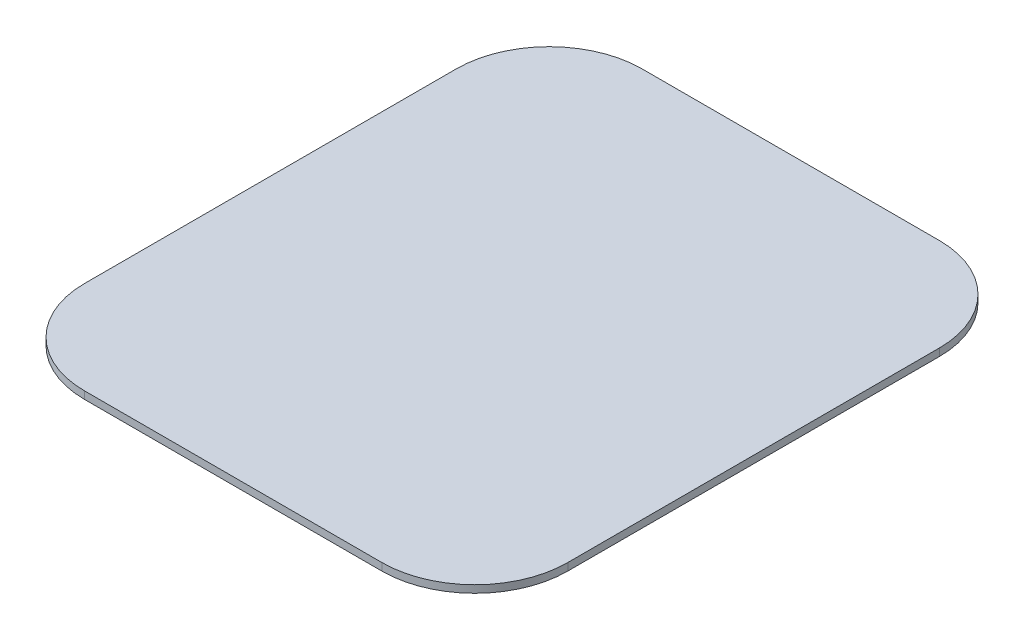
ISO-10303-21;
HEADER;
FILE_DESCRIPTION(('STEP AP214'),'2;1');
FILE_NAME('part.step','',(''),(''),'','','');
FILE_SCHEMA(('AUTOMOTIVE_DESIGN { 1 0 10303 214 1 1 1 1 }'));
ENDSEC;
DATA;
#1=APPLICATION_CONTEXT('core data for automotive mechanical design processes');
#2=APPLICATION_PROTOCOL_DEFINITION('international standard','automotive_design',2000,#1);
#3=PRODUCT_CONTEXT('',#1,'mechanical');
#4=PRODUCT('Part','Part','',(#3));
#5=PRODUCT_RELATED_PRODUCT_CATEGORY('part','',(#4));
#6=PRODUCT_DEFINITION_FORMATION('','',#4);
#7=PRODUCT_DEFINITION_CONTEXT('part definition',#1,'design');
#8=PRODUCT_DEFINITION('design','',#6,#7);
#9=PRODUCT_DEFINITION_SHAPE('','',#8);
#10=(LENGTH_UNIT() NAMED_UNIT(*) SI_UNIT(.MILLI.,.METRE.));
#11=(NAMED_UNIT(*) PLANE_ANGLE_UNIT() SI_UNIT($,.RADIAN.));
#12=(NAMED_UNIT(*) SI_UNIT($,.STERADIAN.) SOLID_ANGLE_UNIT());
#13=UNCERTAINTY_MEASURE_WITH_UNIT(LENGTH_MEASURE(1.E-05),#10,'distance_accuracy_value','');
#14=(GEOMETRIC_REPRESENTATION_CONTEXT(3) GLOBAL_UNCERTAINTY_ASSIGNED_CONTEXT((#13)) GLOBAL_UNIT_ASSIGNED_CONTEXT((#10,
#11,#12)) REPRESENTATION_CONTEXT('',''));
#15=CARTESIAN_POINT('',(0.,0.,0.));
#16=DIRECTION('',(0.,0.,1.));
#17=DIRECTION('',(1.,0.,0.));
#18=AXIS2_PLACEMENT_3D('',#15,#16,#17);
#19=CARTESIAN_POINT('',(160.,4.,-200.));
#20=DIRECTION('',(0.,-1.,0.));
#21=DIRECTION('',(0.,0.,-1.));
#22=AXIS2_PLACEMENT_3D('',#19,#20,#21);
#23=CYLINDRICAL_SURFACE('',#22,100.);
#24=CARTESIAN_POINT('',(160.,-4.,-200.));
#25=DIRECTION('',(0.,1.,0.));
#26=DIRECTION('',(0.,0.,-1.));
#27=AXIS2_PLACEMENT_3D('',#24,#25,#26);
#28=CIRCLE('',#27,100.);
#29=CARTESIAN_POINT('',(260.,-4.,-200.));
#30=VERTEX_POINT('',#29);
#31=CARTESIAN_POINT('',(160.,-4.,-300.));
#32=VERTEX_POINT('',#31);
#33=EDGE_CURVE('E129',#30,#32,#28,.T.);
#34=ORIENTED_EDGE('',*,*,#33,.T.);
#35=DIRECTION('',(0.,-1.,0.));
#36=VECTOR('',#35,1.);
#37=CARTESIAN_POINT('',(160.,4.,-300.));
#38=LINE('',#37,#36);
#39=CARTESIAN_POINT('',(160.,4.,-300.));
#40=VERTEX_POINT('',#39);
#41=EDGE_CURVE('E11',#40,#32,#38,.T.);
#42=ORIENTED_EDGE('',*,*,#41,.F.);
#43=CARTESIAN_POINT('',(160.,4.,-200.));
#44=DIRECTION('',(0.,1.,0.));
#45=DIRECTION('',(0.,0.,-1.));
#46=AXIS2_PLACEMENT_3D('',#43,#44,#45);
#47=CIRCLE('',#46,100.);
#48=CARTESIAN_POINT('',(260.,4.,-200.));
#49=VERTEX_POINT('',#48);
#50=EDGE_CURVE('E143',#49,#40,#47,.T.);
#51=ORIENTED_EDGE('',*,*,#50,.F.);
#52=DIRECTION('',(0.,-1.,0.));
#53=VECTOR('',#52,1.);
#54=CARTESIAN_POINT('',(260.,4.,-200.));
#55=LINE('',#54,#53);
#56=EDGE_CURVE('E125',#49,#30,#55,.T.);
#57=ORIENTED_EDGE('',*,*,#56,.T.);
#58=EDGE_LOOP('',(#34,#42,#51,#57));
#59=FACE_BOUND('',#58,.T.);
#60=ADVANCED_FACE('F33',(#59),#23,.T.);
#61=CARTESIAN_POINT('',(-160.,4.,-300.));
#62=DIRECTION('',(0.,0.,1.));
#63=DIRECTION('',(1.,0.,0.));
#64=AXIS2_PLACEMENT_3D('',#61,#62,#63);
#65=PLANE('',#64);
#66=DIRECTION('',(-1.,0.,0.));
#67=VECTOR('',#66,1.);
#68=CARTESIAN_POINT('',(-160.,-4.,-300.));
#69=LINE('',#68,#67);
#70=CARTESIAN_POINT('',(-160.,-4.,-300.));
#71=VERTEX_POINT('',#70);
#72=EDGE_CURVE('E132',#32,#71,#69,.T.);
#73=ORIENTED_EDGE('',*,*,#72,.T.);
#74=DIRECTION('',(0.,-1.,0.));
#75=VECTOR('',#74,1.);
#76=CARTESIAN_POINT('',(-160.,4.,-300.));
#77=LINE('',#76,#75);
#78=CARTESIAN_POINT('',(-160.,4.,-300.));
#79=VERTEX_POINT('',#78);
#80=EDGE_CURVE('E41',#79,#71,#77,.T.);
#81=ORIENTED_EDGE('',*,*,#80,.F.);
#82=DIRECTION('',(-1.,0.,0.));
#83=VECTOR('',#82,1.);
#84=CARTESIAN_POINT('',(-160.,4.,-300.));
#85=LINE('',#84,#83);
#86=EDGE_CURVE('E92',#40,#79,#85,.T.);
#87=ORIENTED_EDGE('',*,*,#86,.F.);
#88=ORIENTED_EDGE('',*,*,#41,.T.);
#89=EDGE_LOOP('',(#73,#81,#87,#88));
#90=FACE_BOUND('',#89,.T.);
#91=ADVANCED_FACE('F178',(#90),#65,.F.);
#92=CARTESIAN_POINT('',(-160.,4.,-200.));
#93=DIRECTION('',(0.,-1.,0.));
#94=DIRECTION('',(0.,0.,-1.));
#95=AXIS2_PLACEMENT_3D('',#92,#93,#94);
#96=CYLINDRICAL_SURFACE('',#95,100.);
#97=CARTESIAN_POINT('',(-160.,-4.,-200.));
#98=DIRECTION('',(0.,1.,0.));
#99=DIRECTION('',(0.,0.,1.));
#100=AXIS2_PLACEMENT_3D('',#97,#98,#99);
#101=CIRCLE('',#100,100.);
#102=CARTESIAN_POINT('',(-260.,-4.,-200.));
#103=VERTEX_POINT('',#102);
#104=EDGE_CURVE('E134',#71,#103,#101,.T.);
#105=ORIENTED_EDGE('',*,*,#104,.T.);
#106=DIRECTION('',(0.,-1.,0.));
#107=VECTOR('',#106,1.);
#108=CARTESIAN_POINT('',(-260.,4.,-200.));
#109=LINE('',#108,#107);
#110=CARTESIAN_POINT('',(-260.,4.,-200.));
#111=VERTEX_POINT('',#110);
#112=EDGE_CURVE('E150',#111,#103,#109,.T.);
#113=ORIENTED_EDGE('',*,*,#112,.F.);
#114=CARTESIAN_POINT('',(-160.,4.,-200.));
#115=DIRECTION('',(0.,1.,0.));
#116=DIRECTION('',(0.,0.,1.));
#117=AXIS2_PLACEMENT_3D('',#114,#115,#116);
#118=CIRCLE('',#117,100.);
#119=EDGE_CURVE('E158',#79,#111,#118,.T.);
#120=ORIENTED_EDGE('',*,*,#119,.F.);
#121=ORIENTED_EDGE('',*,*,#80,.T.);
#122=EDGE_LOOP('',(#105,#113,#120,#121));
#123=FACE_BOUND('',#122,.T.);
#124=ADVANCED_FACE('F156',(#123),#96,.T.);
#125=CARTESIAN_POINT('',(-260.,4.,-200.));
#126=DIRECTION('',(1.,0.,0.));
#127=DIRECTION('',(0.,0.,-1.));
#128=AXIS2_PLACEMENT_3D('',#125,#126,#127);
#129=PLANE('',#128);
#130=DIRECTION('',(0.,0.,1.));
#131=VECTOR('',#130,1.);
#132=CARTESIAN_POINT('',(-260.,-4.,-200.));
#133=LINE('',#132,#131);
#134=CARTESIAN_POINT('',(-260.,-4.,200.));
#135=VERTEX_POINT('',#134);
#136=EDGE_CURVE('E136',#103,#135,#133,.T.);
#137=ORIENTED_EDGE('',*,*,#136,.T.);
#138=DIRECTION('',(0.,-1.,0.));
#139=VECTOR('',#138,1.);
#140=CARTESIAN_POINT('',(-260.,4.,200.));
#141=LINE('',#140,#139);
#142=CARTESIAN_POINT('',(-260.,4.,200.));
#143=VERTEX_POINT('',#142);
#144=EDGE_CURVE('E147',#143,#135,#141,.T.);
#145=ORIENTED_EDGE('',*,*,#144,.F.);
#146=DIRECTION('',(0.,0.,1.));
#147=VECTOR('',#146,1.);
#148=CARTESIAN_POINT('',(-260.,4.,-200.));
#149=LINE('',#148,#147);
#150=EDGE_CURVE('E170',#111,#143,#149,.T.);
#151=ORIENTED_EDGE('',*,*,#150,.F.);
#152=ORIENTED_EDGE('',*,*,#112,.T.);
#153=EDGE_LOOP('',(#137,#145,#151,#152));
#154=FACE_BOUND('',#153,.T.);
#155=ADVANCED_FACE('F166',(#154),#129,.F.);
#156=CARTESIAN_POINT('',(-160.,4.,200.));
#157=DIRECTION('',(0.,-1.,0.));
#158=DIRECTION('',(0.,0.,-1.));
#159=AXIS2_PLACEMENT_3D('',#156,#157,#158);
#160=CYLINDRICAL_SURFACE('',#159,100.);
#161=CARTESIAN_POINT('',(-160.,-4.,200.));
#162=DIRECTION('',(0.,1.,0.));
#163=DIRECTION('',(0.,0.,1.));
#164=AXIS2_PLACEMENT_3D('',#161,#162,#163);
#165=CIRCLE('',#164,100.);
#166=CARTESIAN_POINT('',(-160.,-4.,300.));
#167=VERTEX_POINT('',#166);
#168=EDGE_CURVE('E138',#135,#167,#165,.T.);
#169=ORIENTED_EDGE('',*,*,#168,.T.);
#170=DIRECTION('',(0.,-1.,0.));
#171=VECTOR('',#170,1.);
#172=CARTESIAN_POINT('',(-160.,4.,300.));
#173=LINE('',#172,#171);
#174=CARTESIAN_POINT('',(-160.,4.,300.));
#175=VERTEX_POINT('',#174);
#176=EDGE_CURVE('E120',#175,#167,#173,.T.);
#177=ORIENTED_EDGE('',*,*,#176,.F.);
#178=CARTESIAN_POINT('',(-160.,4.,200.));
#179=DIRECTION('',(0.,1.,0.));
#180=DIRECTION('',(0.,0.,1.));
#181=AXIS2_PLACEMENT_3D('',#178,#179,#180);
#182=CIRCLE('',#181,100.);
#183=EDGE_CURVE('E111',#143,#175,#182,.T.);
#184=ORIENTED_EDGE('',*,*,#183,.F.);
#185=ORIENTED_EDGE('',*,*,#144,.T.);
#186=EDGE_LOOP('',(#169,#177,#184,#185));
#187=FACE_BOUND('',#186,.T.);
#188=ADVANCED_FACE('F169',(#187),#160,.T.);
#189=CARTESIAN_POINT('',(-160.,4.,300.));
#190=DIRECTION('',(0.,0.,-1.));
#191=DIRECTION('',(-1.,0.,0.));
#192=AXIS2_PLACEMENT_3D('',#189,#190,#191);
#193=PLANE('',#192);
#194=DIRECTION('',(1.,0.,0.));
#195=VECTOR('',#194,1.);
#196=CARTESIAN_POINT('',(-160.,-4.,300.));
#197=LINE('',#196,#195);
#198=CARTESIAN_POINT('',(160.,-4.,300.));
#199=VERTEX_POINT('',#198);
#200=EDGE_CURVE('E119',#167,#199,#197,.T.);
#201=ORIENTED_EDGE('',*,*,#200,.T.);
#202=DIRECTION('',(0.,-1.,0.));
#203=VECTOR('',#202,1.);
#204=CARTESIAN_POINT('',(160.,4.,300.));
#205=LINE('',#204,#203);
#206=CARTESIAN_POINT('',(160.,4.,300.));
#207=VERTEX_POINT('',#206);
#208=EDGE_CURVE('E116',#207,#199,#205,.T.);
#209=ORIENTED_EDGE('',*,*,#208,.F.);
#210=DIRECTION('',(1.,0.,0.));
#211=VECTOR('',#210,1.);
#212=CARTESIAN_POINT('',(-160.,4.,300.));
#213=LINE('',#212,#211);
#214=EDGE_CURVE('E105',#175,#207,#213,.T.);
#215=ORIENTED_EDGE('',*,*,#214,.F.);
#216=ORIENTED_EDGE('',*,*,#176,.T.);
#217=EDGE_LOOP('',(#201,#209,#215,#216));
#218=FACE_BOUND('',#217,.T.);
#219=ADVANCED_FACE('F117',(#218),#193,.F.);
#220=CARTESIAN_POINT('',(160.,4.,200.));
#221=DIRECTION('',(0.,-1.,0.));
#222=DIRECTION('',(0.,0.,-1.));
#223=AXIS2_PLACEMENT_3D('',#220,#221,#222);
#224=CYLINDRICAL_SURFACE('',#223,100.);
#225=CARTESIAN_POINT('',(160.,-4.,200.));
#226=DIRECTION('',(0.,1.,0.));
#227=DIRECTION('',(0.,0.,1.));
#228=AXIS2_PLACEMENT_3D('',#225,#226,#227);
#229=CIRCLE('',#228,100.);
#230=CARTESIAN_POINT('',(260.,-4.,200.));
#231=VERTEX_POINT('',#230);
#232=EDGE_CURVE('E78',#199,#231,#229,.T.);
#233=ORIENTED_EDGE('',*,*,#232,.T.);
#234=DIRECTION('',(0.,-1.,0.));
#235=VECTOR('',#234,1.);
#236=CARTESIAN_POINT('',(260.,4.,200.));
#237=LINE('',#236,#235);
#238=CARTESIAN_POINT('',(260.,4.,200.));
#239=VERTEX_POINT('',#238);
#240=EDGE_CURVE('E121',#239,#231,#237,.T.);
#241=ORIENTED_EDGE('',*,*,#240,.F.);
#242=CARTESIAN_POINT('',(160.,4.,200.));
#243=DIRECTION('',(0.,1.,0.));
#244=DIRECTION('',(0.,0.,1.));
#245=AXIS2_PLACEMENT_3D('',#242,#243,#244);
#246=CIRCLE('',#245,100.);
#247=EDGE_CURVE('E109',#207,#239,#246,.T.);
#248=ORIENTED_EDGE('',*,*,#247,.F.);
#249=ORIENTED_EDGE('',*,*,#208,.T.);
#250=EDGE_LOOP('',(#233,#241,#248,#249));
#251=FACE_BOUND('',#250,.T.);
#252=ADVANCED_FACE('F123',(#251),#224,.T.);
#253=CARTESIAN_POINT('',(260.,4.,-200.));
#254=DIRECTION('',(-1.,0.,0.));
#255=DIRECTION('',(0.,0.,1.));
#256=AXIS2_PLACEMENT_3D('',#253,#254,#255);
#257=PLANE('',#256);
#258=DIRECTION('',(0.,0.,-1.));
#259=VECTOR('',#258,1.);
#260=CARTESIAN_POINT('',(260.,-4.,-200.));
#261=LINE('',#260,#259);
#262=EDGE_CURVE('E84',#231,#30,#261,.T.);
#263=ORIENTED_EDGE('',*,*,#262,.T.);
#264=ORIENTED_EDGE('',*,*,#56,.F.);
#265=DIRECTION('',(0.,0.,-1.));
#266=VECTOR('',#265,1.);
#267=CARTESIAN_POINT('',(260.,4.,-200.));
#268=LINE('',#267,#266);
#269=EDGE_CURVE('E49',#239,#49,#268,.T.);
#270=ORIENTED_EDGE('',*,*,#269,.F.);
#271=ORIENTED_EDGE('',*,*,#240,.T.);
#272=EDGE_LOOP('',(#263,#264,#270,#271));
#273=FACE_BOUND('',#272,.T.);
#274=ADVANCED_FACE('F194',(#273),#257,.F.);
#275=CARTESIAN_POINT('',(160.,4.,-200.));
#276=DIRECTION('',(0.,-1.,0.));
#277=DIRECTION('',(0.,0.,-1.));
#278=AXIS2_PLACEMENT_3D('',#275,#276,#277);
#279=PLANE('',#278);
#280=ORIENTED_EDGE('',*,*,#50,.T.);
#281=ORIENTED_EDGE('',*,*,#86,.T.);
#282=ORIENTED_EDGE('',*,*,#119,.T.);
#283=ORIENTED_EDGE('',*,*,#150,.T.);
#284=ORIENTED_EDGE('',*,*,#183,.T.);
#285=ORIENTED_EDGE('',*,*,#214,.T.);
#286=ORIENTED_EDGE('',*,*,#247,.T.);
#287=ORIENTED_EDGE('',*,*,#269,.T.);
#288=EDGE_LOOP('',(#280,#281,#282,#283,#284,#285,#286,#287));
#289=FACE_BOUND('',#288,.T.);
#290=ADVANCED_FACE('F107',(#289),#279,.F.);
#291=CARTESIAN_POINT('',(160.,-4.,-200.));
#292=DIRECTION('',(0.,-1.,0.));
#293=DIRECTION('',(0.,0.,-1.));
#294=AXIS2_PLACEMENT_3D('',#291,#292,#293);
#295=PLANE('',#294);
#296=ORIENTED_EDGE('',*,*,#33,.F.);
#297=ORIENTED_EDGE('',*,*,#262,.F.);
#298=ORIENTED_EDGE('',*,*,#232,.F.);
#299=ORIENTED_EDGE('',*,*,#200,.F.);
#300=ORIENTED_EDGE('',*,*,#168,.F.);
#301=ORIENTED_EDGE('',*,*,#136,.F.);
#302=ORIENTED_EDGE('',*,*,#104,.F.);
#303=ORIENTED_EDGE('',*,*,#72,.F.);
#304=EDGE_LOOP('',(#296,#297,#298,#299,#300,#301,#302,#303));
#305=FACE_BOUND('',#304,.T.);
#306=ADVANCED_FACE('F162',(#305),#295,.T.);
#307=CLOSED_SHELL('',(#60,#91,#124,#155,#188,#219,#252,#274,#290,#306));
#308=MANIFOLD_SOLID_BREP('B2',#307);
#309=ADVANCED_BREP_SHAPE_REPRESENTATION('',(#18,#308),#14);
#310=SHAPE_DEFINITION_REPRESENTATION(#9,#309);
ENDSEC;
END-ISO-10303-21;
